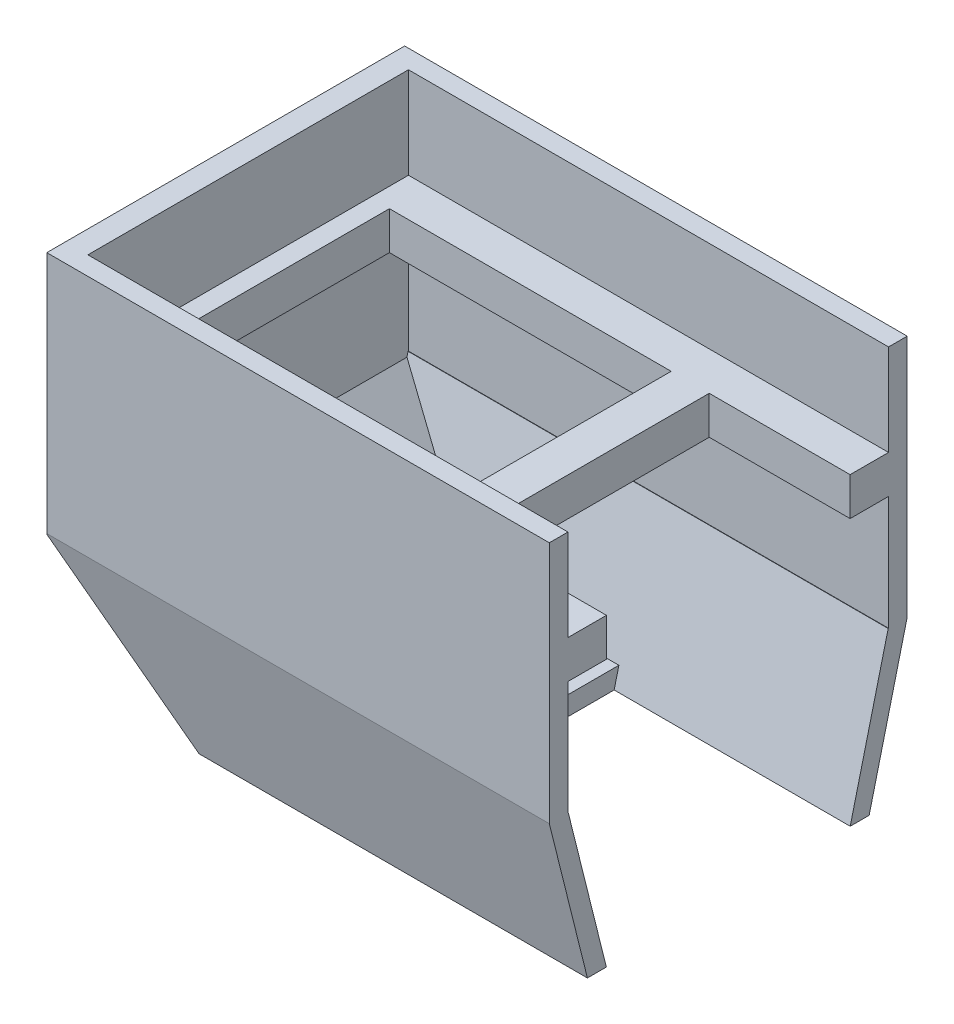
ISO-10303-21;
HEADER;
FILE_DESCRIPTION(('STEP AP214'),'2;1');
FILE_NAME('part.step','',(''),(''),'','','');
FILE_SCHEMA(('AUTOMOTIVE_DESIGN { 1 0 10303 214 1 1 1 1 }'));
ENDSEC;
DATA;
#1=APPLICATION_CONTEXT('core data for automotive mechanical design processes');
#2=APPLICATION_PROTOCOL_DEFINITION('international standard','automotive_design',2000,#1);
#3=PRODUCT_CONTEXT('',#1,'mechanical');
#4=PRODUCT('Part','Part','',(#3));
#5=PRODUCT_RELATED_PRODUCT_CATEGORY('part','',(#4));
#6=PRODUCT_DEFINITION_FORMATION('','',#4);
#7=PRODUCT_DEFINITION_CONTEXT('part definition',#1,'design');
#8=PRODUCT_DEFINITION('design','',#6,#7);
#9=PRODUCT_DEFINITION_SHAPE('','',#8);
#10=(LENGTH_UNIT() NAMED_UNIT(*) SI_UNIT(.MILLI.,.METRE.));
#11=(NAMED_UNIT(*) PLANE_ANGLE_UNIT() SI_UNIT($,.RADIAN.));
#12=(NAMED_UNIT(*) SI_UNIT($,.STERADIAN.) SOLID_ANGLE_UNIT());
#13=UNCERTAINTY_MEASURE_WITH_UNIT(LENGTH_MEASURE(1.E-05),#10,'distance_accuracy_value','');
#14=(GEOMETRIC_REPRESENTATION_CONTEXT(3) GLOBAL_UNCERTAINTY_ASSIGNED_CONTEXT((#13)) GLOBAL_UNIT_ASSIGNED_CONTEXT((#10,
#11,#12)) REPRESENTATION_CONTEXT('',''));
#15=CARTESIAN_POINT('',(0.,0.,0.));
#16=DIRECTION('',(0.,0.,1.));
#17=DIRECTION('',(1.,0.,0.));
#18=AXIS2_PLACEMENT_3D('',#15,#16,#17);
#19=CARTESIAN_POINT('',(0.,-30.,42.0000000000003));
#20=DIRECTION('',(0.,-0.241921895599665,0.970295726275997));
#21=DIRECTION('',(-1.,0.,0.));
#22=AXIS2_PLACEMENT_3D('',#19,#20,#21);
#23=PLANE('',#22);
#24=DIRECTION('',(-1.,0.,0.));
#25=VECTOR('',#24,1.);
#26=CARTESIAN_POINT('',(0.,-70.,32.0268798862732));
#27=LINE('',#26,#25);
#28=CARTESIAN_POINT('',(-61.9999999999999,-70.,32.0268798862732));
#29=VERTEX_POINT('',#28);
#30=CARTESIAN_POINT('',(0.,-70.,32.0268798862732));
#31=VERTEX_POINT('',#30);
#32=EDGE_CURVE('E287',#29,#31,#27,.F.);
#33=ORIENTED_EDGE('',*,*,#32,.F.);
#34=DIRECTION('',(0.,-0.970295726275997,-0.241921895599665));
#35=VECTOR('',#34,1.);
#36=CARTESIAN_POINT('',(-61.9999999999999,-30.,42.0000000000003));
#37=LINE('',#36,#35);
#38=CARTESIAN_POINT('',(-61.9999999999999,-65.,33.2735199004891));
#39=VERTEX_POINT('',#38);
#40=EDGE_CURVE('E279',#29,#39,#37,.F.);
#41=ORIENTED_EDGE('',*,*,#40,.T.);
#42=DIRECTION('',(-1.,0.,0.));
#43=VECTOR('',#42,1.);
#44=CARTESIAN_POINT('',(0.,-65.,33.2735199004891));
#45=LINE('',#44,#43);
#46=CARTESIAN_POINT('',(-71.9999999999999,-65.,33.2735199004891));
#47=VERTEX_POINT('',#46);
#48=EDGE_CURVE('E277',#47,#39,#45,.F.);
#49=ORIENTED_EDGE('',*,*,#48,.F.);
#50=DIRECTION('',(0.,0.970295726275997,0.241921895599665));
#51=VECTOR('',#50,1.);
#52=CARTESIAN_POINT('',(-71.9999999999999,-30.,42.0000000000003));
#53=LINE('',#52,#51);
#54=CARTESIAN_POINT('',(-71.9999999999999,-70.,32.0268798862732));
#55=VERTEX_POINT('',#54);
#56=EDGE_CURVE('E263',#47,#55,#53,.F.);
#57=ORIENTED_EDGE('',*,*,#56,.T.);
#58=CARTESIAN_POINT('',(-96.9999999999999,-70.,32.0268798862732));
#59=VERTEX_POINT('',#58);
#60=EDGE_CURVE('E275',#59,#55,#27,.F.);
#61=ORIENTED_EDGE('',*,*,#60,.F.);
#62=DIRECTION('',(0.,0.970295726275997,0.241921895599665));
#63=VECTOR('',#62,1.);
#64=CARTESIAN_POINT('',(-96.9999999999999,-32.3473578139295,41.4147379642949));
#65=LINE('',#64,#63);
#66=CARTESIAN_POINT('',(-96.9999999999999,-69.811344648613,32.0739169482602));
#67=VERTEX_POINT('',#66);
#68=EDGE_CURVE('E511',#67,#59,#65,.F.);
#69=ORIENTED_EDGE('',*,*,#68,.F.);
#70=DIRECTION('',(0.59022760709962,-0.783258489578964,-0.195288274916687));
#71=VECTOR('',#70,1.);
#72=CARTESIAN_POINT('',(-82.7571842208171,-88.7121995736713,27.3614045377668));
#73=LINE('',#72,#71);
#74=CARTESIAN_POINT('',(-126.1,-31.1943403394587,41.702217508448));
#75=VERTEX_POINT('',#74);
#76=EDGE_CURVE('E588',#75,#67,#73,.T.);
#77=ORIENTED_EDGE('',*,*,#76,.F.);
#78=DIRECTION('',(0.,0.970295726275997,0.241921895599665));
#79=VECTOR('',#78,1.);
#80=CARTESIAN_POINT('',(-126.1,-87.4002310723251,27.6885150240005));
#81=LINE('',#80,#79);
#82=CARTESIAN_POINT('',(-126.1,-30.,42.0000000000003));
#83=VERTEX_POINT('',#82);
#84=EDGE_CURVE('E592',#83,#75,#81,.F.);
#85=ORIENTED_EDGE('',*,*,#84,.F.);
#86=DIRECTION('',(-1.,0.,0.));
#87=VECTOR('',#86,1.);
#88=CARTESIAN_POINT('',(0.,-30.,42.0000000000003));
#89=LINE('',#88,#87);
#90=CARTESIAN_POINT('',(0.,-30.,42.0000000000003));
#91=VERTEX_POINT('',#90);
#92=EDGE_CURVE('E291',#91,#83,#89,.T.);
#93=ORIENTED_EDGE('',*,*,#92,.F.);
#94=DIRECTION('',(0.,0.970295726275997,0.241921895599665));
#95=VECTOR('',#94,1.);
#96=CARTESIAN_POINT('',(0.,-30.,42.0000000000003));
#97=LINE('',#96,#95);
#98=EDGE_CURVE('E512',#91,#31,#97,.F.);
#99=ORIENTED_EDGE('',*,*,#98,.T.);
#100=EDGE_LOOP('',(#33,#41,#49,#57,#61,#69,#77,#85,#93,#99));
#101=FACE_BOUND('',#100,.T.);
#102=ADVANCED_FACE('F45',(#101),#23,.F.);
#103=CARTESIAN_POINT('',(0.,-30.,-42.0000000000003));
#104=DIRECTION('',(0.,-0.241921895599665,-0.970295726275997));
#105=DIRECTION('',(1.,0.,0.));
#106=AXIS2_PLACEMENT_3D('',#103,#104,#105);
#107=PLANE('',#106);
#108=DIRECTION('',(1.,0.,0.));
#109=VECTOR('',#108,1.);
#110=CARTESIAN_POINT('',(0.,-65.,-33.273519900489));
#111=LINE('',#110,#109);
#112=CARTESIAN_POINT('',(-61.9999999999999,-65.,-33.273519900489));
#113=VERTEX_POINT('',#112);
#114=CARTESIAN_POINT('',(-71.9999999999999,-65.,-33.273519900489));
#115=VERTEX_POINT('',#114);
#116=EDGE_CURVE('E55',#113,#115,#111,.F.);
#117=ORIENTED_EDGE('',*,*,#116,.F.);
#118=DIRECTION('',(0.,0.970295726275997,-0.241921895599665));
#119=VECTOR('',#118,1.);
#120=CARTESIAN_POINT('',(-61.9999999999999,-30.,-42.0000000000003));
#121=LINE('',#120,#119);
#122=CARTESIAN_POINT('',(-61.9999999999999,-70.,-32.0268798862732));
#123=VERTEX_POINT('',#122);
#124=EDGE_CURVE('E11',#113,#123,#121,.F.);
#125=ORIENTED_EDGE('',*,*,#124,.T.);
#126=DIRECTION('',(1.,0.,0.));
#127=VECTOR('',#126,1.);
#128=CARTESIAN_POINT('',(0.,-70.,-32.0268798862732));
#129=LINE('',#128,#127);
#130=CARTESIAN_POINT('',(0.,-70.,-32.0268798862732));
#131=VERTEX_POINT('',#130);
#132=EDGE_CURVE('E305',#131,#123,#129,.F.);
#133=ORIENTED_EDGE('',*,*,#132,.F.);
#134=DIRECTION('',(0.,-0.970295726275997,0.241921895599665));
#135=VECTOR('',#134,1.);
#136=CARTESIAN_POINT('',(0.,-30.,-42.0000000000003));
#137=LINE('',#136,#135);
#138=CARTESIAN_POINT('',(0.,-30.,-42.0000000000003));
#139=VERTEX_POINT('',#138);
#140=EDGE_CURVE('E520',#131,#139,#137,.F.);
#141=ORIENTED_EDGE('',*,*,#140,.T.);
#142=DIRECTION('',(1.,0.,0.));
#143=VECTOR('',#142,1.);
#144=CARTESIAN_POINT('',(0.,-30.,-42.0000000000003));
#145=LINE('',#144,#143);
#146=CARTESIAN_POINT('',(-126.1,-30.,-42.0000000000003));
#147=VERTEX_POINT('',#146);
#148=EDGE_CURVE('E311',#147,#139,#145,.T.);
#149=ORIENTED_EDGE('',*,*,#148,.F.);
#150=DIRECTION('',(0.,-0.970295726275997,0.241921895599665));
#151=VECTOR('',#150,1.);
#152=CARTESIAN_POINT('',(-126.1,-67.6354782790394,-32.6164213646396));
#153=LINE('',#152,#151);
#154=CARTESIAN_POINT('',(-126.1,-31.1943403394587,-41.702217508448));
#155=VERTEX_POINT('',#154);
#156=EDGE_CURVE('E299',#155,#147,#153,.F.);
#157=ORIENTED_EDGE('',*,*,#156,.F.);
#158=DIRECTION('',(-0.59022760709962,0.783258489578964,-0.195288274916687));
#159=VECTOR('',#158,1.);
#160=CARTESIAN_POINT('',(-82.7571842208171,-88.7121995736713,-27.3614045377667));
#161=LINE('',#160,#159);
#162=CARTESIAN_POINT('',(-96.9999999999999,-69.811344648613,-32.0739169482602));
#163=VERTEX_POINT('',#162);
#164=EDGE_CURVE('E402',#163,#155,#161,.T.);
#165=ORIENTED_EDGE('',*,*,#164,.F.);
#166=DIRECTION('',(0.,-0.970295726275997,0.241921895599665));
#167=VECTOR('',#166,1.);
#168=CARTESIAN_POINT('',(-96.9999999999999,-47.3704478230779,-37.6690609357807));
#169=LINE('',#168,#167);
#170=CARTESIAN_POINT('',(-96.9999999999999,-70.,-32.0268798862732));
#171=VERTEX_POINT('',#170);
#172=EDGE_CURVE('E392',#171,#163,#169,.F.);
#173=ORIENTED_EDGE('',*,*,#172,.F.);
#174=CARTESIAN_POINT('',(-71.9999999999999,-70.,-32.0268798862732));
#175=VERTEX_POINT('',#174);
#176=EDGE_CURVE('E303',#175,#171,#129,.F.);
#177=ORIENTED_EDGE('',*,*,#176,.F.);
#178=DIRECTION('',(0.,-0.970295726275997,0.241921895599665));
#179=VECTOR('',#178,1.);
#180=CARTESIAN_POINT('',(-71.9999999999999,-30.,-42.0000000000003));
#181=LINE('',#180,#179);
#182=EDGE_CURVE('E266',#175,#115,#181,.F.);
#183=ORIENTED_EDGE('',*,*,#182,.T.);
#184=EDGE_LOOP('',(#117,#125,#133,#141,#149,#157,#165,#173,#177,#183));
#185=FACE_BOUND('',#184,.T.);
#186=ADVANCED_FACE('F388',(#185),#107,.F.);
#187=CARTESIAN_POINT('',(0.,0.,0.));
#188=DIRECTION('',(1.,0.,0.));
#189=DIRECTION('',(0.,0.,-1.));
#190=AXIS2_PLACEMENT_3D('',#187,#188,#189);
#191=PLANE('',#190);
#192=DIRECTION('',(0.,-1.,0.));
#193=VECTOR('',#192,1.);
#194=CARTESIAN_POINT('',(0.,10.,-32.));
#195=LINE('',#194,#193);
#196=CARTESIAN_POINT('',(0.,10.,-32.));
#197=VERTEX_POINT('',#196);
#198=CARTESIAN_POINT('',(0.,0.,-32.));
#199=VERTEX_POINT('',#198);
#200=EDGE_CURVE('E555',#197,#199,#195,.T.);
#201=ORIENTED_EDGE('',*,*,#200,.T.);
#202=DIRECTION('',(0.,0.,-1.));
#203=VECTOR('',#202,1.);
#204=CARTESIAN_POINT('',(0.,0.,0.));
#205=LINE('',#204,#203);
#206=CARTESIAN_POINT('',(0.,0.,-42.1));
#207=VERTEX_POINT('',#206);
#208=EDGE_CURVE('E560',#199,#207,#205,.T.);
#209=ORIENTED_EDGE('',*,*,#208,.T.);
#210=DIRECTION('',(0.,-1.,0.));
#211=VECTOR('',#210,1.);
#212=CARTESIAN_POINT('',(0.,-70.,-42.1));
#213=LINE('',#212,#211);
#214=CARTESIAN_POINT('',(0.,-30.,-42.1));
#215=VERTEX_POINT('',#214);
#216=EDGE_CURVE('E551',#207,#215,#213,.T.);
#217=ORIENTED_EDGE('',*,*,#216,.T.);
#218=DIRECTION('',(0.,0.,1.));
#219=VECTOR('',#218,1.);
#220=CARTESIAN_POINT('',(0.,-30.,0.));
#221=LINE('',#220,#219);
#222=EDGE_CURVE('E576',#215,#139,#221,.T.);
#223=ORIENTED_EDGE('',*,*,#222,.T.);
#224=ORIENTED_EDGE('',*,*,#140,.F.);
#225=DIRECTION('',(0.,0.,-1.));
#226=VECTOR('',#225,1.);
#227=CARTESIAN_POINT('',(0.,-70.,0.));
#228=LINE('',#227,#226);
#229=CARTESIAN_POINT('',(0.,-70.,-37.));
#230=VERTEX_POINT('',#229);
#231=EDGE_CURVE('E565',#131,#230,#228,.T.);
#232=ORIENTED_EDGE('',*,*,#231,.T.);
#233=DIRECTION('',(0.,-0.970295726275996,0.241921895599669));
#234=VECTOR('',#233,1.);
#235=CARTESIAN_POINT('',(0.,-29.8921906646418,-47.));
#236=LINE('',#235,#234);
#237=CARTESIAN_POINT('',(0.,-29.8921906646418,-47.));
#238=VERTEX_POINT('',#237);
#239=EDGE_CURVE('E516',#238,#230,#236,.T.);
#240=ORIENTED_EDGE('',*,*,#239,.F.);
#241=DIRECTION('',(0.,-1.,0.));
#242=VECTOR('',#241,1.);
#243=CARTESIAN_POINT('',(0.,-70.,-47.));
#244=LINE('',#243,#242);
#245=CARTESIAN_POINT('',(0.,34.,-47.));
#246=VERTEX_POINT('',#245);
#247=EDGE_CURVE('E527',#246,#238,#244,.T.);
#248=ORIENTED_EDGE('',*,*,#247,.F.);
#249=DIRECTION('',(0.,0.,-1.));
#250=VECTOR('',#249,1.);
#251=CARTESIAN_POINT('',(0.,34.,0.));
#252=LINE('',#251,#250);
#253=CARTESIAN_POINT('',(0.,34.,-42.1));
#254=VERTEX_POINT('',#253);
#255=EDGE_CURVE('E523',#254,#246,#252,.T.);
#256=ORIENTED_EDGE('',*,*,#255,.F.);
#257=DIRECTION('',(0.,-1.,0.));
#258=VECTOR('',#257,1.);
#259=CARTESIAN_POINT('',(0.,-70.,-42.1));
#260=LINE('',#259,#258);
#261=CARTESIAN_POINT('',(0.,10.,-42.1));
#262=VERTEX_POINT('',#261);
#263=EDGE_CURVE('E573',#254,#262,#260,.T.);
#264=ORIENTED_EDGE('',*,*,#263,.T.);
#265=DIRECTION('',(0.,0.,-1.));
#266=VECTOR('',#265,1.);
#267=CARTESIAN_POINT('',(0.,10.,0.));
#268=LINE('',#267,#266);
#269=EDGE_CURVE('E535',#197,#262,#268,.T.);
#270=ORIENTED_EDGE('',*,*,#269,.F.);
#271=EDGE_LOOP('',(#201,#209,#217,#223,#224,#232,#240,#248,#256,#264,#270));
#272=FACE_BOUND('',#271,.T.);
#273=ADVANCED_FACE('F647',(#272),#191,.T.);
#274=DIRECTION('',(0.,0.,1.));
#275=VECTOR('',#274,1.);
#276=CARTESIAN_POINT('',(0.,-30.,0.));
#277=LINE('',#276,#275);
#278=CARTESIAN_POINT('',(0.,-30.,42.1));
#279=VERTEX_POINT('',#278);
#280=EDGE_CURVE('E543',#91,#279,#277,.T.);
#281=ORIENTED_EDGE('',*,*,#280,.T.);
#282=DIRECTION('',(0.,1.,0.));
#283=VECTOR('',#282,1.);
#284=CARTESIAN_POINT('',(0.,-70.,42.1));
#285=LINE('',#284,#283);
#286=CARTESIAN_POINT('',(0.,0.,42.1));
#287=VERTEX_POINT('',#286);
#288=EDGE_CURVE('E547',#279,#287,#285,.T.);
#289=ORIENTED_EDGE('',*,*,#288,.T.);
#290=CARTESIAN_POINT('',(0.,0.,32.));
#291=VERTEX_POINT('',#290);
#292=EDGE_CURVE('E559',#287,#291,#205,.T.);
#293=ORIENTED_EDGE('',*,*,#292,.T.);
#294=DIRECTION('',(0.,-1.,0.));
#295=VECTOR('',#294,1.);
#296=CARTESIAN_POINT('',(0.,10.,32.));
#297=LINE('',#296,#295);
#298=CARTESIAN_POINT('',(0.,10.,32.));
#299=VERTEX_POINT('',#298);
#300=EDGE_CURVE('E539',#299,#291,#297,.T.);
#301=ORIENTED_EDGE('',*,*,#300,.F.);
#302=CARTESIAN_POINT('',(0.,10.,42.1));
#303=VERTEX_POINT('',#302);
#304=EDGE_CURVE('E536',#303,#299,#268,.T.);
#305=ORIENTED_EDGE('',*,*,#304,.F.);
#306=DIRECTION('',(0.,1.,0.));
#307=VECTOR('',#306,1.);
#308=CARTESIAN_POINT('',(0.,-70.,42.1));
#309=LINE('',#308,#307);
#310=CARTESIAN_POINT('',(0.,34.,42.1));
#311=VERTEX_POINT('',#310);
#312=EDGE_CURVE('E569',#303,#311,#309,.T.);
#313=ORIENTED_EDGE('',*,*,#312,.T.);
#314=CARTESIAN_POINT('',(0.,34.,47.));
#315=VERTEX_POINT('',#314);
#316=EDGE_CURVE('E524',#315,#311,#252,.T.);
#317=ORIENTED_EDGE('',*,*,#316,.F.);
#318=DIRECTION('',(0.,1.,0.));
#319=VECTOR('',#318,1.);
#320=CARTESIAN_POINT('',(0.,-70.,47.));
#321=LINE('',#320,#319);
#322=CARTESIAN_POINT('',(0.,-29.8921906646418,47.));
#323=VERTEX_POINT('',#322);
#324=EDGE_CURVE('E531',#323,#315,#321,.T.);
#325=ORIENTED_EDGE('',*,*,#324,.F.);
#326=DIRECTION('',(0.,0.970295726275996,0.241921895599669));
#327=VECTOR('',#326,1.);
#328=CARTESIAN_POINT('',(0.,-29.8921906646418,47.));
#329=LINE('',#328,#327);
#330=CARTESIAN_POINT('',(0.,-70.,37.));
#331=VERTEX_POINT('',#330);
#332=EDGE_CURVE('E508',#331,#323,#329,.T.);
#333=ORIENTED_EDGE('',*,*,#332,.F.);
#334=EDGE_CURVE('E564',#331,#31,#228,.T.);
#335=ORIENTED_EDGE('',*,*,#334,.T.);
#336=ORIENTED_EDGE('',*,*,#98,.F.);
#337=EDGE_LOOP('',(#281,#289,#293,#301,#305,#313,#317,#325,#333,#335,#336));
#338=FACE_BOUND('',#337,.T.);
#339=ADVANCED_FACE('F617',(#338),#191,.T.);
#340=CARTESIAN_POINT('',(0.,10.,32.));
#341=DIRECTION('',(0.,0.,-1.));
#342=DIRECTION('',(-1.,0.,0.));
#343=AXIS2_PLACEMENT_3D('',#340,#341,#342);
#344=PLANE('',#343);
#345=DIRECTION('',(1.,0.,0.));
#346=VECTOR('',#345,1.);
#347=CARTESIAN_POINT('',(0.,10.,32.));
#348=LINE('',#347,#346);
#349=CARTESIAN_POINT('',(-37.,10.,32.));
#350=VERTEX_POINT('',#349);
#351=EDGE_CURVE('E316',#350,#299,#348,.T.);
#352=ORIENTED_EDGE('',*,*,#351,.T.);
#353=ORIENTED_EDGE('',*,*,#300,.T.);
#354=DIRECTION('',(1.,0.,0.));
#355=VECTOR('',#354,1.);
#356=CARTESIAN_POINT('',(0.,0.,32.));
#357=LINE('',#356,#355);
#358=CARTESIAN_POINT('',(-37.,0.,32.));
#359=VERTEX_POINT('',#358);
#360=EDGE_CURVE('E335',#359,#291,#357,.T.);
#361=ORIENTED_EDGE('',*,*,#360,.F.);
#362=DIRECTION('',(0.,-1.,0.));
#363=VECTOR('',#362,1.);
#364=CARTESIAN_POINT('',(-37.,10.,32.));
#365=LINE('',#364,#363);
#366=EDGE_CURVE('E428',#350,#359,#365,.T.);
#367=ORIENTED_EDGE('',*,*,#366,.F.);
#368=EDGE_LOOP('',(#352,#353,#361,#367));
#369=FACE_BOUND('',#368,.T.);
#370=ADVANCED_FACE('F679',(#369),#344,.T.);
#371=CARTESIAN_POINT('',(-37.,10.,0.));
#372=DIRECTION('',(1.,0.,0.));
#373=DIRECTION('',(0.,0.,-1.));
#374=AXIS2_PLACEMENT_3D('',#371,#372,#373);
#375=PLANE('',#374);
#376=DIRECTION('',(0.,0.,1.));
#377=VECTOR('',#376,1.);
#378=CARTESIAN_POINT('',(-37.,0.,0.));
#379=LINE('',#378,#377);
#380=CARTESIAN_POINT('',(-37.,0.,-32.));
#381=VERTEX_POINT('',#380);
#382=EDGE_CURVE('E334',#381,#359,#379,.T.);
#383=ORIENTED_EDGE('',*,*,#382,.F.);
#384=DIRECTION('',(0.,-1.,0.));
#385=VECTOR('',#384,1.);
#386=CARTESIAN_POINT('',(-37.,10.,-32.));
#387=LINE('',#386,#385);
#388=CARTESIAN_POINT('',(-37.,10.,-32.));
#389=VERTEX_POINT('',#388);
#390=EDGE_CURVE('E433',#389,#381,#387,.T.);
#391=ORIENTED_EDGE('',*,*,#390,.F.);
#392=DIRECTION('',(0.,0.,1.));
#393=VECTOR('',#392,1.);
#394=CARTESIAN_POINT('',(-37.,10.,0.));
#395=LINE('',#394,#393);
#396=EDGE_CURVE('E321',#389,#350,#395,.T.);
#397=ORIENTED_EDGE('',*,*,#396,.T.);
#398=ORIENTED_EDGE('',*,*,#366,.T.);
#399=EDGE_LOOP('',(#383,#391,#397,#398));
#400=FACE_BOUND('',#399,.T.);
#401=ADVANCED_FACE('F685',(#400),#375,.T.);
#402=CARTESIAN_POINT('',(0.,10.,-32.));
#403=DIRECTION('',(0.,0.,-1.));
#404=DIRECTION('',(-1.,0.,0.));
#405=AXIS2_PLACEMENT_3D('',#402,#403,#404);
#406=PLANE('',#405);
#407=ORIENTED_EDGE('',*,*,#200,.F.);
#408=DIRECTION('',(1.,0.,0.));
#409=VECTOR('',#408,1.);
#410=CARTESIAN_POINT('',(0.,10.,-32.));
#411=LINE('',#410,#409);
#412=EDGE_CURVE('E320',#389,#197,#411,.T.);
#413=ORIENTED_EDGE('',*,*,#412,.F.);
#414=ORIENTED_EDGE('',*,*,#390,.T.);
#415=DIRECTION('',(1.,0.,0.));
#416=VECTOR('',#415,1.);
#417=CARTESIAN_POINT('',(0.,0.,-32.));
#418=LINE('',#417,#416);
#419=EDGE_CURVE('E338',#381,#199,#418,.T.);
#420=ORIENTED_EDGE('',*,*,#419,.T.);
#421=EDGE_LOOP('',(#407,#413,#414,#420));
#422=FACE_BOUND('',#421,.T.);
#423=ADVANCED_FACE('F690',(#422),#406,.F.);
#424=CARTESIAN_POINT('',(0.,10.,0.));
#425=DIRECTION('',(0.,1.,0.));
#426=DIRECTION('',(0.,0.,1.));
#427=AXIS2_PLACEMENT_3D('',#424,#425,#426);
#428=PLANE('',#427);
#429=DIRECTION('',(0.,0.,-1.));
#430=VECTOR('',#429,1.);
#431=CARTESIAN_POINT('',(-47.,10.,0.));
#432=LINE('',#431,#430);
#433=CARTESIAN_POINT('',(-47.,10.,32.));
#434=VERTEX_POINT('',#433);
#435=CARTESIAN_POINT('',(-47.,10.,-32.));
#436=VERTEX_POINT('',#435);
#437=EDGE_CURVE('E330',#434,#436,#432,.T.);
#438=ORIENTED_EDGE('',*,*,#437,.F.);
#439=DIRECTION('',(-1.,0.,0.));
#440=VECTOR('',#439,1.);
#441=CARTESIAN_POINT('',(0.,10.,32.));
#442=LINE('',#441,#440);
#443=CARTESIAN_POINT('',(-121.,10.,32.));
#444=VERTEX_POINT('',#443);
#445=EDGE_CURVE('E476',#434,#444,#442,.T.);
#446=ORIENTED_EDGE('',*,*,#445,.T.);
#447=DIRECTION('',(0.,0.,-1.));
#448=VECTOR('',#447,1.);
#449=CARTESIAN_POINT('',(-121.,10.,0.));
#450=LINE('',#449,#448);
#451=CARTESIAN_POINT('',(-121.,10.,-32.));
#452=VERTEX_POINT('',#451);
#453=EDGE_CURVE('E473',#444,#452,#450,.T.);
#454=ORIENTED_EDGE('',*,*,#453,.T.);
#455=DIRECTION('',(-1.,0.,0.));
#456=VECTOR('',#455,1.);
#457=CARTESIAN_POINT('',(0.,10.,-32.));
#458=LINE('',#457,#456);
#459=EDGE_CURVE('E325',#436,#452,#458,.T.);
#460=ORIENTED_EDGE('',*,*,#459,.F.);
#461=EDGE_LOOP('',(#438,#446,#454,#460));
#462=FACE_BOUND('',#461,.T.);
#463=DIRECTION('',(1.,0.,0.));
#464=VECTOR('',#463,1.);
#465=CARTESIAN_POINT('',(0.,10.,42.1));
#466=LINE('',#465,#464);
#467=CARTESIAN_POINT('',(-126.1,10.,42.1));
#468=VERTEX_POINT('',#467);
#469=EDGE_CURVE('E326',#468,#303,#466,.T.);
#470=ORIENTED_EDGE('',*,*,#469,.T.);
#471=ORIENTED_EDGE('',*,*,#304,.T.);
#472=ORIENTED_EDGE('',*,*,#351,.F.);
#473=ORIENTED_EDGE('',*,*,#396,.F.);
#474=ORIENTED_EDGE('',*,*,#412,.T.);
#475=ORIENTED_EDGE('',*,*,#269,.T.);
#476=DIRECTION('',(1.,0.,0.));
#477=VECTOR('',#476,1.);
#478=CARTESIAN_POINT('',(0.,10.,-42.1));
#479=LINE('',#478,#477);
#480=CARTESIAN_POINT('',(-126.1,10.,-42.1));
#481=VERTEX_POINT('',#480);
#482=EDGE_CURVE('E331',#481,#262,#479,.T.);
#483=ORIENTED_EDGE('',*,*,#482,.F.);
#484=DIRECTION('',(0.,0.,1.));
#485=VECTOR('',#484,1.);
#486=CARTESIAN_POINT('',(-126.1,10.,0.));
#487=LINE('',#486,#485);
#488=EDGE_CURVE('E329',#481,#468,#487,.T.);
#489=ORIENTED_EDGE('',*,*,#488,.T.);
#490=EDGE_LOOP('',(#470,#471,#472,#473,#474,#475,#483,#489));
#491=FACE_BOUND('',#490,.T.);
#492=ADVANCED_FACE('F682',(#462,#491),#428,.T.);
#493=CARTESIAN_POINT('',(-126.1,-70.,-42.1));
#494=DIRECTION('',(0.,0.,-1.));
#495=DIRECTION('',(-1.,0.,0.));
#496=AXIS2_PLACEMENT_3D('',#493,#494,#495);
#497=PLANE('',#496);
#498=ORIENTED_EDGE('',*,*,#263,.F.);
#499=DIRECTION('',(-1.,0.,0.));
#500=VECTOR('',#499,1.);
#501=CARTESIAN_POINT('',(-126.1,34.,-42.1));
#502=LINE('',#501,#500);
#503=CARTESIAN_POINT('',(-126.1,34.,-42.1));
#504=VERTEX_POINT('',#503);
#505=EDGE_CURVE('E365',#254,#504,#502,.T.);
#506=ORIENTED_EDGE('',*,*,#505,.T.);
#507=DIRECTION('',(0.,1.,0.));
#508=VECTOR('',#507,1.);
#509=CARTESIAN_POINT('',(-126.1,-70.,-42.1));
#510=LINE('',#509,#508);
#511=EDGE_CURVE('E356',#481,#504,#510,.T.);
#512=ORIENTED_EDGE('',*,*,#511,.F.);
#513=ORIENTED_EDGE('',*,*,#482,.T.);
#514=EDGE_LOOP('',(#498,#506,#512,#513));
#515=FACE_BOUND('',#514,.T.);
#516=ADVANCED_FACE('F693',(#515),#497,.F.);
#517=CARTESIAN_POINT('',(-126.1,-70.,-42.1));
#518=DIRECTION('',(-1.,0.,0.));
#519=DIRECTION('',(0.,0.,1.));
#520=AXIS2_PLACEMENT_3D('',#517,#518,#519);
#521=PLANE('',#520);
#522=ORIENTED_EDGE('',*,*,#488,.F.);
#523=ORIENTED_EDGE('',*,*,#511,.T.);
#524=DIRECTION('',(0.,0.,1.));
#525=VECTOR('',#524,1.);
#526=CARTESIAN_POINT('',(-126.1,34.,-42.1));
#527=LINE('',#526,#525);
#528=CARTESIAN_POINT('',(-126.1,34.,42.1));
#529=VERTEX_POINT('',#528);
#530=EDGE_CURVE('E364',#504,#529,#527,.T.);
#531=ORIENTED_EDGE('',*,*,#530,.T.);
#532=DIRECTION('',(0.,1.,0.));
#533=VECTOR('',#532,1.);
#534=CARTESIAN_POINT('',(-126.1,-70.,42.1));
#535=LINE('',#534,#533);
#536=EDGE_CURVE('E495',#468,#529,#535,.T.);
#537=ORIENTED_EDGE('',*,*,#536,.F.);
#538=EDGE_LOOP('',(#522,#523,#531,#537));
#539=FACE_BOUND('',#538,.T.);
#540=ADVANCED_FACE('F703',(#539),#521,.F.);
#541=CARTESIAN_POINT('',(-126.1,-70.,42.1));
#542=DIRECTION('',(0.,0.,1.));
#543=DIRECTION('',(1.,0.,0.));
#544=AXIS2_PLACEMENT_3D('',#541,#542,#543);
#545=PLANE('',#544);
#546=ORIENTED_EDGE('',*,*,#312,.F.);
#547=ORIENTED_EDGE('',*,*,#469,.F.);
#548=ORIENTED_EDGE('',*,*,#536,.T.);
#549=DIRECTION('',(1.,0.,0.));
#550=VECTOR('',#549,1.);
#551=CARTESIAN_POINT('',(-126.1,34.,42.1));
#552=LINE('',#551,#550);
#553=EDGE_CURVE('E360',#529,#311,#552,.T.);
#554=ORIENTED_EDGE('',*,*,#553,.T.);
#555=EDGE_LOOP('',(#546,#547,#548,#554));
#556=FACE_BOUND('',#555,.T.);
#557=ADVANCED_FACE('F702',(#556),#545,.F.);
#558=ORIENTED_EDGE('',*,*,#216,.F.);
#559=DIRECTION('',(1.,0.,0.));
#560=VECTOR('',#559,1.);
#561=CARTESIAN_POINT('',(0.,0.,-42.1));
#562=LINE('',#561,#560);
#563=CARTESIAN_POINT('',(-126.1,0.,-42.1));
#564=VERTEX_POINT('',#563);
#565=EDGE_CURVE('E347',#564,#207,#562,.T.);
#566=ORIENTED_EDGE('',*,*,#565,.F.);
#567=CARTESIAN_POINT('',(-126.1,-30.,-42.1));
#568=VERTEX_POINT('',#567);
#569=EDGE_CURVE('E492',#568,#564,#510,.T.);
#570=ORIENTED_EDGE('',*,*,#569,.F.);
#571=DIRECTION('',(-1.,0.,0.));
#572=VECTOR('',#571,1.);
#573=CARTESIAN_POINT('',(-126.1,-30.,-42.1));
#574=LINE('',#573,#572);
#575=EDGE_CURVE('E372',#215,#568,#574,.T.);
#576=ORIENTED_EDGE('',*,*,#575,.F.);
#577=EDGE_LOOP('',(#558,#566,#570,#576));
#578=FACE_BOUND('',#577,.T.);
#579=ADVANCED_FACE('F710',(#578),#497,.F.);
#580=CARTESIAN_POINT('',(0.,-30.,0.));
#581=DIRECTION('',(0.,-1.,0.));
#582=DIRECTION('',(0.,0.,-1.));
#583=AXIS2_PLACEMENT_3D('',#580,#581,#582);
#584=PLANE('',#583);
#585=ORIENTED_EDGE('',*,*,#222,.F.);
#586=ORIENTED_EDGE('',*,*,#575,.T.);
#587=DIRECTION('',(0.,0.,1.));
#588=VECTOR('',#587,1.);
#589=CARTESIAN_POINT('',(-126.1,-30.,-42.1));
#590=LINE('',#589,#588);
#591=EDGE_CURVE('E371',#568,#147,#590,.T.);
#592=ORIENTED_EDGE('',*,*,#591,.T.);
#593=ORIENTED_EDGE('',*,*,#148,.T.);
#594=EDGE_LOOP('',(#585,#586,#592,#593));
#595=FACE_BOUND('',#594,.T.);
#596=ADVANCED_FACE('F717',(#595),#584,.F.);
#597=ORIENTED_EDGE('',*,*,#591,.F.);
#598=ORIENTED_EDGE('',*,*,#569,.T.);
#599=DIRECTION('',(0.,0.,1.));
#600=VECTOR('',#599,1.);
#601=CARTESIAN_POINT('',(-126.1,0.,0.));
#602=LINE('',#601,#600);
#603=CARTESIAN_POINT('',(-126.1,0.,42.1));
#604=VERTEX_POINT('',#603);
#605=EDGE_CURVE('E345',#564,#604,#602,.T.);
#606=ORIENTED_EDGE('',*,*,#605,.T.);
#607=CARTESIAN_POINT('',(-126.1,-30.,42.1));
#608=VERTEX_POINT('',#607);
#609=EDGE_CURVE('E489',#608,#604,#535,.T.);
#610=ORIENTED_EDGE('',*,*,#609,.F.);
#611=EDGE_CURVE('E375',#83,#608,#590,.T.);
#612=ORIENTED_EDGE('',*,*,#611,.F.);
#613=ORIENTED_EDGE('',*,*,#84,.T.);
#614=DIRECTION('',(0.,0.,1.));
#615=VECTOR('',#614,1.);
#616=CARTESIAN_POINT('',(-126.1,-31.1943403394587,-42.1));
#617=LINE('',#616,#615);
#618=EDGE_CURVE('E315',#75,#155,#617,.F.);
#619=ORIENTED_EDGE('',*,*,#618,.T.);
#620=ORIENTED_EDGE('',*,*,#156,.T.);
#621=EDGE_LOOP('',(#597,#598,#606,#610,#612,#613,#619,#620));
#622=FACE_BOUND('',#621,.T.);
#623=ADVANCED_FACE('F667',(#622),#521,.F.);
#624=CARTESIAN_POINT('',(-127.,-30.,0.));
#625=DIRECTION('',(-0.798635510047295,-0.601815023152045,0.));
#626=DIRECTION('',(0.,0.,-1.));
#627=AXIS2_PLACEMENT_3D('',#624,#625,#626);
#628=PLANE('',#627);
#629=ORIENTED_EDGE('',*,*,#618,.F.);
#630=ORIENTED_EDGE('',*,*,#76,.T.);
#631=DIRECTION('',(0.,0.,1.));
#632=VECTOR('',#631,1.);
#633=CARTESIAN_POINT('',(-96.9999999999999,-69.811344648613,32.));
#634=LINE('',#633,#632);
#635=EDGE_CURVE('E425',#163,#67,#634,.T.);
#636=ORIENTED_EDGE('',*,*,#635,.F.);
#637=ORIENTED_EDGE('',*,*,#164,.T.);
#638=EDGE_LOOP('',(#629,#630,#636,#637));
#639=FACE_BOUND('',#638,.T.);
#640=ADVANCED_FACE('F716',(#639),#628,.F.);
#641=CARTESIAN_POINT('',(-96.9999999999999,-30.,32.));
#642=DIRECTION('',(-1.,0.,0.));
#643=DIRECTION('',(0.,0.,1.));
#644=AXIS2_PLACEMENT_3D('',#641,#642,#643);
#645=PLANE('',#644);
#646=DIRECTION('',(0.,0.,-1.));
#647=VECTOR('',#646,1.);
#648=CARTESIAN_POINT('',(-96.9999999999999,-70.,32.));
#649=LINE('',#648,#647);
#650=EDGE_CURVE('E283',#59,#171,#649,.T.);
#651=ORIENTED_EDGE('',*,*,#650,.T.);
#652=ORIENTED_EDGE('',*,*,#172,.T.);
#653=ORIENTED_EDGE('',*,*,#635,.T.);
#654=ORIENTED_EDGE('',*,*,#68,.T.);
#655=EDGE_LOOP('',(#651,#652,#653,#654));
#656=FACE_BOUND('',#655,.T.);
#657=ADVANCED_FACE('F762',(#656),#645,.F.);
#658=CARTESIAN_POINT('',(-132.,-30.1886553513878,-47.));
#659=DIRECTION('',(-0.798635510047291,-0.60181502315205,0.));
#660=DIRECTION('',(0.,0.,-1.));
#661=AXIS2_PLACEMENT_3D('',#658,#659,#660);
#662=PLANE('',#661);
#663=DIRECTION('',(0.,0.,-1.));
#664=VECTOR('',#663,1.);
#665=CARTESIAN_POINT('',(-102.,-70.,-47.));
#666=LINE('',#665,#664);
#667=CARTESIAN_POINT('',(-102.,-70.,37.));
#668=VERTEX_POINT('',#667);
#669=CARTESIAN_POINT('',(-102.,-70.,-37.));
#670=VERTEX_POINT('',#669);
#671=EDGE_CURVE('E418',#668,#670,#666,.T.);
#672=ORIENTED_EDGE('',*,*,#671,.F.);
#673=DIRECTION('',(-0.590227607099626,0.78325848957896,0.19528827491669));
#674=VECTOR('',#673,1.);
#675=CARTESIAN_POINT('',(-121.173654069712,-44.5557016552479,43.3439760900431));
#676=LINE('',#675,#674);
#677=CARTESIAN_POINT('',(-132.,-30.1886553513878,46.9260830517401));
#678=VERTEX_POINT('',#677);
#679=EDGE_CURVE('E413',#668,#678,#676,.T.);
#680=ORIENTED_EDGE('',*,*,#679,.T.);
#681=DIRECTION('',(0.,0.,1.));
#682=VECTOR('',#681,1.);
#683=CARTESIAN_POINT('',(-132.,-30.1886553513878,47.));
#684=LINE('',#683,#682);
#685=CARTESIAN_POINT('',(-132.,-30.1886553513878,-46.9260830517401));
#686=VERTEX_POINT('',#685);
#687=EDGE_CURVE('E421',#686,#678,#684,.T.);
#688=ORIENTED_EDGE('',*,*,#687,.F.);
#689=DIRECTION('',(0.590227607099626,-0.78325848957896,0.19528827491669));
#690=VECTOR('',#689,1.);
#691=CARTESIAN_POINT('',(-132.008520002389,-30.1773489263376,-46.9289020601172));
#692=LINE('',#691,#690);
#693=EDGE_CURVE('E396',#686,#670,#692,.T.);
#694=ORIENTED_EDGE('',*,*,#693,.T.);
#695=EDGE_LOOP('',(#672,#680,#688,#694));
#696=FACE_BOUND('',#695,.T.);
#697=ADVANCED_FACE('F637',(#696),#662,.T.);
#698=CARTESIAN_POINT('',(-132.,-70.,-47.));
#699=DIRECTION('',(-1.,0.,0.));
#700=DIRECTION('',(0.,0.,1.));
#701=AXIS2_PLACEMENT_3D('',#698,#699,#700);
#702=PLANE('',#701);
#703=ORIENTED_EDGE('',*,*,#687,.T.);
#704=DIRECTION('',(0.,0.970295726275996,0.241921895599669));
#705=VECTOR('',#704,1.);
#706=CARTESIAN_POINT('',(-132.,-89.7178056370076,32.0837989000749));
#707=LINE('',#706,#705);
#708=CARTESIAN_POINT('',(-132.,-29.8921906646418,47.));
#709=VERTEX_POINT('',#708);
#710=EDGE_CURVE('E595',#678,#709,#707,.T.);
#711=ORIENTED_EDGE('',*,*,#710,.T.);
#712=DIRECTION('',(0.,1.,0.));
#713=VECTOR('',#712,1.);
#714=CARTESIAN_POINT('',(-132.,-70.,47.));
#715=LINE('',#714,#713);
#716=CARTESIAN_POINT('',(-132.,34.,47.));
#717=VERTEX_POINT('',#716);
#718=EDGE_CURVE('E350',#709,#717,#715,.T.);
#719=ORIENTED_EDGE('',*,*,#718,.T.);
#720=DIRECTION('',(0.,0.,1.));
#721=VECTOR('',#720,1.);
#722=CARTESIAN_POINT('',(-132.,34.,-47.));
#723=LINE('',#722,#721);
#724=CARTESIAN_POINT('',(-132.,34.,-47.));
#725=VERTEX_POINT('',#724);
#726=EDGE_CURVE('E355',#725,#717,#723,.T.);
#727=ORIENTED_EDGE('',*,*,#726,.F.);
#728=DIRECTION('',(0.,1.,0.));
#729=VECTOR('',#728,1.);
#730=CARTESIAN_POINT('',(-132.,-70.,-47.));
#731=LINE('',#730,#729);
#732=CARTESIAN_POINT('',(-132.,-29.8921906646418,-47.));
#733=VERTEX_POINT('',#732);
#734=EDGE_CURVE('E485',#733,#725,#731,.T.);
#735=ORIENTED_EDGE('',*,*,#734,.F.);
#736=DIRECTION('',(0.,-0.970295726275996,0.241921895599669));
#737=VECTOR('',#736,1.);
#738=CARTESIAN_POINT('',(-132.,-67.6526421860705,-37.5852620357054));
#739=LINE('',#738,#737);
#740=EDGE_CURVE('E304',#733,#686,#739,.T.);
#741=ORIENTED_EDGE('',*,*,#740,.T.);
#742=EDGE_LOOP('',(#703,#711,#719,#727,#735,#741));
#743=FACE_BOUND('',#742,.T.);
#744=ADVANCED_FACE('F627',(#743),#702,.T.);
#745=CARTESIAN_POINT('',(-132.,-70.,47.));
#746=DIRECTION('',(0.,0.,1.));
#747=DIRECTION('',(1.,0.,0.));
#748=AXIS2_PLACEMENT_3D('',#745,#746,#747);
#749=PLANE('',#748);
#750=DIRECTION('',(1.,0.,0.));
#751=VECTOR('',#750,1.);
#752=CARTESIAN_POINT('',(102.,-29.8921906646418,47.));
#753=LINE('',#752,#751);
#754=EDGE_CURVE('E293',#709,#323,#753,.T.);
#755=ORIENTED_EDGE('',*,*,#754,.T.);
#756=ORIENTED_EDGE('',*,*,#324,.T.);
#757=DIRECTION('',(1.,0.,0.));
#758=VECTOR('',#757,1.);
#759=CARTESIAN_POINT('',(-132.,34.,47.));
#760=LINE('',#759,#758);
#761=EDGE_CURVE('E351',#717,#315,#760,.T.);
#762=ORIENTED_EDGE('',*,*,#761,.F.);
#763=ORIENTED_EDGE('',*,*,#718,.F.);
#764=EDGE_LOOP('',(#755,#756,#762,#763));
#765=FACE_BOUND('',#764,.T.);
#766=ADVANCED_FACE('F609',(#765),#749,.T.);
#767=CARTESIAN_POINT('',(0.,-70.,0.));
#768=DIRECTION('',(0.,1.,0.));
#769=DIRECTION('',(0.,0.,1.));
#770=AXIS2_PLACEMENT_3D('',#767,#768,#769);
#771=PLANE('',#770);
#772=ORIENTED_EDGE('',*,*,#60,.T.);
#773=DIRECTION('',(0.,0.,1.));
#774=VECTOR('',#773,1.);
#775=CARTESIAN_POINT('',(-71.9999999999999,-70.,37.));
#776=LINE('',#775,#774);
#777=EDGE_CURVE('E70',#175,#55,#776,.T.);
#778=ORIENTED_EDGE('',*,*,#777,.F.);
#779=ORIENTED_EDGE('',*,*,#176,.T.);
#780=ORIENTED_EDGE('',*,*,#650,.F.);
#781=EDGE_LOOP('',(#772,#778,#779,#780));
#782=FACE_BOUND('',#781,.T.);
#783=DIRECTION('',(1.,0.,0.));
#784=VECTOR('',#783,1.);
#785=CARTESIAN_POINT('',(102.,-70.,-37.));
#786=LINE('',#785,#784);
#787=EDGE_CURVE('E308',#670,#230,#786,.T.);
#788=ORIENTED_EDGE('',*,*,#787,.T.);
#789=ORIENTED_EDGE('',*,*,#231,.F.);
#790=ORIENTED_EDGE('',*,*,#132,.T.);
#791=DIRECTION('',(0.,0.,-1.));
#792=VECTOR('',#791,1.);
#793=CARTESIAN_POINT('',(-61.9999999999999,-70.,37.));
#794=LINE('',#793,#792);
#795=EDGE_CURVE('E62',#29,#123,#794,.T.);
#796=ORIENTED_EDGE('',*,*,#795,.F.);
#797=ORIENTED_EDGE('',*,*,#32,.T.);
#798=ORIENTED_EDGE('',*,*,#334,.F.);
#799=DIRECTION('',(-1.,0.,0.));
#800=VECTOR('',#799,1.);
#801=CARTESIAN_POINT('',(-102.,-70.,37.));
#802=LINE('',#801,#800);
#803=EDGE_CURVE('E286',#331,#668,#802,.T.);
#804=ORIENTED_EDGE('',*,*,#803,.T.);
#805=ORIENTED_EDGE('',*,*,#671,.T.);
#806=EDGE_LOOP('',(#788,#789,#790,#796,#797,#798,#804,#805));
#807=FACE_BOUND('',#806,.T.);
#808=ADVANCED_FACE('F281',(#782,#807),#771,.F.);
#809=CARTESIAN_POINT('',(-132.,-29.8921906646418,47.));
#810=DIRECTION('',(0.,-0.241921895599669,0.970295726275996));
#811=DIRECTION('',(-1.,0.,0.));
#812=AXIS2_PLACEMENT_3D('',#809,#810,#811);
#813=PLANE('',#812);
#814=ORIENTED_EDGE('',*,*,#803,.F.);
#815=ORIENTED_EDGE('',*,*,#332,.T.);
#816=ORIENTED_EDGE('',*,*,#754,.F.);
#817=ORIENTED_EDGE('',*,*,#710,.F.);
#818=ORIENTED_EDGE('',*,*,#679,.F.);
#819=EDGE_LOOP('',(#814,#815,#816,#817,#818));
#820=FACE_BOUND('',#819,.T.);
#821=ADVANCED_FACE('F48',(#820),#813,.T.);
#822=ORIENTED_EDGE('',*,*,#280,.F.);
#823=ORIENTED_EDGE('',*,*,#92,.T.);
#824=ORIENTED_EDGE('',*,*,#611,.T.);
#825=DIRECTION('',(1.,0.,0.));
#826=VECTOR('',#825,1.);
#827=CARTESIAN_POINT('',(-126.1,-30.,42.1));
#828=LINE('',#827,#826);
#829=EDGE_CURVE('E368',#608,#279,#828,.T.);
#830=ORIENTED_EDGE('',*,*,#829,.T.);
#831=EDGE_LOOP('',(#822,#823,#824,#830));
#832=FACE_BOUND('',#831,.T.);
#833=ADVANCED_FACE('F661',(#832),#584,.F.);
#834=CARTESIAN_POINT('',(-132.,-70.,-47.));
#835=DIRECTION('',(0.,0.,-1.));
#836=DIRECTION('',(-1.,0.,0.));
#837=AXIS2_PLACEMENT_3D('',#834,#835,#836);
#838=PLANE('',#837);
#839=DIRECTION('',(-1.,0.,0.));
#840=VECTOR('',#839,1.);
#841=CARTESIAN_POINT('',(-132.,34.,-47.));
#842=LINE('',#841,#840);
#843=EDGE_CURVE('E357',#246,#725,#842,.T.);
#844=ORIENTED_EDGE('',*,*,#843,.F.);
#845=ORIENTED_EDGE('',*,*,#247,.T.);
#846=DIRECTION('',(-1.,0.,0.));
#847=VECTOR('',#846,1.);
#848=CARTESIAN_POINT('',(-102.,-29.8921906646418,-47.));
#849=LINE('',#848,#847);
#850=EDGE_CURVE('E300',#238,#733,#849,.T.);
#851=ORIENTED_EDGE('',*,*,#850,.T.);
#852=ORIENTED_EDGE('',*,*,#734,.T.);
#853=EDGE_LOOP('',(#844,#845,#851,#852));
#854=FACE_BOUND('',#853,.T.);
#855=ADVANCED_FACE('F630',(#854),#838,.T.);
#856=CARTESIAN_POINT('',(-132.,-29.8921906646418,-47.));
#857=DIRECTION('',(0.,-0.241921895599669,-0.970295726275996));
#858=DIRECTION('',(1.,0.,0.));
#859=AXIS2_PLACEMENT_3D('',#856,#857,#858);
#860=PLANE('',#859);
#861=ORIENTED_EDGE('',*,*,#850,.F.);
#862=ORIENTED_EDGE('',*,*,#239,.T.);
#863=ORIENTED_EDGE('',*,*,#787,.F.);
#864=ORIENTED_EDGE('',*,*,#693,.F.);
#865=ORIENTED_EDGE('',*,*,#740,.F.);
#866=EDGE_LOOP('',(#861,#862,#863,#864,#865));
#867=FACE_BOUND('',#866,.T.);
#868=ADVANCED_FACE('F635',(#867),#860,.T.);
#869=CARTESIAN_POINT('',(0.,34.,0.));
#870=DIRECTION('',(0.,1.,0.));
#871=DIRECTION('',(0.,0.,1.));
#872=AXIS2_PLACEMENT_3D('',#869,#870,#871);
#873=PLANE('',#872);
#874=ORIENTED_EDGE('',*,*,#761,.T.);
#875=ORIENTED_EDGE('',*,*,#316,.T.);
#876=ORIENTED_EDGE('',*,*,#553,.F.);
#877=ORIENTED_EDGE('',*,*,#530,.F.);
#878=ORIENTED_EDGE('',*,*,#505,.F.);
#879=ORIENTED_EDGE('',*,*,#255,.T.);
#880=ORIENTED_EDGE('',*,*,#843,.T.);
#881=ORIENTED_EDGE('',*,*,#726,.T.);
#882=EDGE_LOOP('',(#874,#875,#876,#877,#878,#879,#880,#881));
#883=FACE_BOUND('',#882,.T.);
#884=ADVANCED_FACE('F622',(#883),#873,.T.);
#885=ORIENTED_EDGE('',*,*,#288,.F.);
#886=ORIENTED_EDGE('',*,*,#829,.F.);
#887=ORIENTED_EDGE('',*,*,#609,.T.);
#888=DIRECTION('',(1.,0.,0.));
#889=VECTOR('',#888,1.);
#890=CARTESIAN_POINT('',(0.,0.,42.1));
#891=LINE('',#890,#889);
#892=EDGE_CURVE('E342',#604,#287,#891,.T.);
#893=ORIENTED_EDGE('',*,*,#892,.T.);
#894=EDGE_LOOP('',(#885,#886,#887,#893));
#895=FACE_BOUND('',#894,.T.);
#896=ADVANCED_FACE('F666',(#895),#545,.F.);
#897=CARTESIAN_POINT('',(0.,10.,32.));
#898=DIRECTION('',(0.,0.,1.));
#899=DIRECTION('',(1.,0.,0.));
#900=AXIS2_PLACEMENT_3D('',#897,#898,#899);
#901=PLANE('',#900);
#902=DIRECTION('',(-1.,0.,0.));
#903=VECTOR('',#902,1.);
#904=CARTESIAN_POINT('',(0.,0.,32.));
#905=LINE('',#904,#903);
#906=CARTESIAN_POINT('',(-47.,0.,32.));
#907=VERTEX_POINT('',#906);
#908=CARTESIAN_POINT('',(-121.,0.,32.));
#909=VERTEX_POINT('',#908);
#910=EDGE_CURVE('E457',#907,#909,#905,.T.);
#911=ORIENTED_EDGE('',*,*,#910,.T.);
#912=DIRECTION('',(0.,-1.,0.));
#913=VECTOR('',#912,1.);
#914=CARTESIAN_POINT('',(-121.,10.,32.));
#915=LINE('',#914,#913);
#916=EDGE_CURVE('E432',#444,#909,#915,.T.);
#917=ORIENTED_EDGE('',*,*,#916,.F.);
#918=ORIENTED_EDGE('',*,*,#445,.F.);
#919=DIRECTION('',(0.,-1.,0.));
#920=VECTOR('',#919,1.);
#921=CARTESIAN_POINT('',(-47.,10.,32.));
#922=LINE('',#921,#920);
#923=EDGE_CURVE('E429',#434,#907,#922,.T.);
#924=ORIENTED_EDGE('',*,*,#923,.T.);
#925=EDGE_LOOP('',(#911,#917,#918,#924));
#926=FACE_BOUND('',#925,.T.);
#927=ADVANCED_FACE('F758',(#926),#901,.F.);
#928=CARTESIAN_POINT('',(-121.,10.,0.));
#929=DIRECTION('',(-1.,0.,0.));
#930=DIRECTION('',(0.,0.,1.));
#931=AXIS2_PLACEMENT_3D('',#928,#929,#930);
#932=PLANE('',#931);
#933=DIRECTION('',(0.,0.,-1.));
#934=VECTOR('',#933,1.);
#935=CARTESIAN_POINT('',(-121.,0.,0.));
#936=LINE('',#935,#934);
#937=CARTESIAN_POINT('',(-121.,0.,-32.));
#938=VERTEX_POINT('',#937);
#939=EDGE_CURVE('E453',#909,#938,#936,.T.);
#940=ORIENTED_EDGE('',*,*,#939,.T.);
#941=DIRECTION('',(0.,-1.,0.));
#942=VECTOR('',#941,1.);
#943=CARTESIAN_POINT('',(-121.,10.,-32.));
#944=LINE('',#943,#942);
#945=EDGE_CURVE('E437',#452,#938,#944,.T.);
#946=ORIENTED_EDGE('',*,*,#945,.F.);
#947=ORIENTED_EDGE('',*,*,#453,.F.);
#948=ORIENTED_EDGE('',*,*,#916,.T.);
#949=EDGE_LOOP('',(#940,#946,#947,#948));
#950=FACE_BOUND('',#949,.T.);
#951=ADVANCED_FACE('F894',(#950),#932,.F.);
#952=CARTESIAN_POINT('',(0.,10.,-32.));
#953=DIRECTION('',(0.,0.,1.));
#954=DIRECTION('',(1.,0.,0.));
#955=AXIS2_PLACEMENT_3D('',#952,#953,#954);
#956=PLANE('',#955);
#957=DIRECTION('',(-1.,0.,0.));
#958=VECTOR('',#957,1.);
#959=CARTESIAN_POINT('',(0.,0.,-32.));
#960=LINE('',#959,#958);
#961=CARTESIAN_POINT('',(-47.,0.,-32.));
#962=VERTEX_POINT('',#961);
#963=EDGE_CURVE('E341',#962,#938,#960,.T.);
#964=ORIENTED_EDGE('',*,*,#963,.F.);
#965=DIRECTION('',(0.,-1.,0.));
#966=VECTOR('',#965,1.);
#967=CARTESIAN_POINT('',(-47.,10.,-32.));
#968=LINE('',#967,#966);
#969=EDGE_CURVE('E440',#436,#962,#968,.T.);
#970=ORIENTED_EDGE('',*,*,#969,.F.);
#971=ORIENTED_EDGE('',*,*,#459,.T.);
#972=ORIENTED_EDGE('',*,*,#945,.T.);
#973=EDGE_LOOP('',(#964,#970,#971,#972));
#974=FACE_BOUND('',#973,.T.);
#975=ADVANCED_FACE('F884',(#974),#956,.T.);
#976=CARTESIAN_POINT('',(-47.,10.,0.));
#977=DIRECTION('',(-1.,0.,0.));
#978=DIRECTION('',(0.,0.,1.));
#979=AXIS2_PLACEMENT_3D('',#976,#977,#978);
#980=PLANE('',#979);
#981=DIRECTION('',(0.,0.,-1.));
#982=VECTOR('',#981,1.);
#983=CARTESIAN_POINT('',(-47.,0.,0.));
#984=LINE('',#983,#982);
#985=EDGE_CURVE('E346',#907,#962,#984,.T.);
#986=ORIENTED_EDGE('',*,*,#985,.F.);
#987=ORIENTED_EDGE('',*,*,#923,.F.);
#988=ORIENTED_EDGE('',*,*,#437,.T.);
#989=ORIENTED_EDGE('',*,*,#969,.T.);
#990=EDGE_LOOP('',(#986,#987,#988,#989));
#991=FACE_BOUND('',#990,.T.);
#992=ADVANCED_FACE('F746',(#991),#980,.T.);
#993=CARTESIAN_POINT('',(0.,0.,0.));
#994=DIRECTION('',(0.,1.,0.));
#995=DIRECTION('',(0.,0.,1.));
#996=AXIS2_PLACEMENT_3D('',#993,#994,#995);
#997=PLANE('',#996);
#998=ORIENTED_EDGE('',*,*,#985,.T.);
#999=ORIENTED_EDGE('',*,*,#963,.T.);
#1000=ORIENTED_EDGE('',*,*,#939,.F.);
#1001=ORIENTED_EDGE('',*,*,#910,.F.);
#1002=EDGE_LOOP('',(#998,#999,#1000,#1001));
#1003=FACE_BOUND('',#1002,.T.);
#1004=ORIENTED_EDGE('',*,*,#292,.F.);
#1005=ORIENTED_EDGE('',*,*,#892,.F.);
#1006=ORIENTED_EDGE('',*,*,#605,.F.);
#1007=ORIENTED_EDGE('',*,*,#565,.T.);
#1008=ORIENTED_EDGE('',*,*,#208,.F.);
#1009=ORIENTED_EDGE('',*,*,#419,.F.);
#1010=ORIENTED_EDGE('',*,*,#382,.T.);
#1011=ORIENTED_EDGE('',*,*,#360,.T.);
#1012=EDGE_LOOP('',(#1004,#1005,#1006,#1007,#1008,#1009,#1010,#1011));
#1013=FACE_BOUND('',#1012,.T.);
#1014=ADVANCED_FACE('F674',(#1003,#1013),#997,.F.);
#1015=CARTESIAN_POINT('',(0.,-65.,0.));
#1016=DIRECTION('',(0.,1.,0.));
#1017=DIRECTION('',(0.,0.,1.));
#1018=AXIS2_PLACEMENT_3D('',#1015,#1016,#1017);
#1019=PLANE('',#1018);
#1020=DIRECTION('',(0.,0.,-1.));
#1021=VECTOR('',#1020,1.);
#1022=CARTESIAN_POINT('',(-71.9999999999999,-65.,37.));
#1023=LINE('',#1022,#1021);
#1024=EDGE_CURVE('E382',#47,#115,#1023,.T.);
#1025=ORIENTED_EDGE('',*,*,#1024,.F.);
#1026=ORIENTED_EDGE('',*,*,#48,.T.);
#1027=DIRECTION('',(0.,0.,1.));
#1028=VECTOR('',#1027,1.);
#1029=CARTESIAN_POINT('',(-61.9999999999999,-65.,37.));
#1030=LINE('',#1029,#1028);
#1031=EDGE_CURVE('E384',#113,#39,#1030,.T.);
#1032=ORIENTED_EDGE('',*,*,#1031,.F.);
#1033=ORIENTED_EDGE('',*,*,#116,.T.);
#1034=EDGE_LOOP('',(#1025,#1026,#1032,#1033));
#1035=FACE_BOUND('',#1034,.T.);
#1036=ADVANCED_FACE('F381',(#1035),#1019,.T.);
#1037=CARTESIAN_POINT('',(-61.9999999999999,-144.672618810378,37.));
#1038=DIRECTION('',(-1.,0.,0.));
#1039=DIRECTION('',(0.,0.,1.));
#1040=AXIS2_PLACEMENT_3D('',#1037,#1038,#1039);
#1041=PLANE('',#1040);
#1042=ORIENTED_EDGE('',*,*,#40,.F.);
#1043=ORIENTED_EDGE('',*,*,#795,.T.);
#1044=ORIENTED_EDGE('',*,*,#124,.F.);
#1045=ORIENTED_EDGE('',*,*,#1031,.T.);
#1046=EDGE_LOOP('',(#1042,#1043,#1044,#1045));
#1047=FACE_BOUND('',#1046,.T.);
#1048=ADVANCED_FACE('F651',(#1047),#1041,.F.);
#1049=CARTESIAN_POINT('',(-71.9999999999999,-144.672618810378,37.));
#1050=DIRECTION('',(1.,0.,0.));
#1051=DIRECTION('',(0.,0.,-1.));
#1052=AXIS2_PLACEMENT_3D('',#1049,#1050,#1051);
#1053=PLANE('',#1052);
#1054=ORIENTED_EDGE('',*,*,#56,.F.);
#1055=ORIENTED_EDGE('',*,*,#1024,.T.);
#1056=ORIENTED_EDGE('',*,*,#182,.F.);
#1057=ORIENTED_EDGE('',*,*,#777,.T.);
#1058=EDGE_LOOP('',(#1054,#1055,#1056,#1057));
#1059=FACE_BOUND('',#1058,.T.);
#1060=ADVANCED_FACE('F261',(#1059),#1053,.F.);
#1061=CLOSED_SHELL('',(#102,#186,#273,#339,#370,#401,#423,#492,#516,#540,#557,#579,#596,#623,
#640,#657,#697,#744,#766,#808,#821,#833,#855,#868,#884,#896,#927,#951,#975,#992,#1014,#1036,
#1048,#1060));
#1062=MANIFOLD_SOLID_BREP('B2',#1061);
#1063=ADVANCED_BREP_SHAPE_REPRESENTATION('',(#18,#1062),#14);
#1064=SHAPE_DEFINITION_REPRESENTATION(#9,#1063);
ENDSEC;
END-ISO-10303-21;
